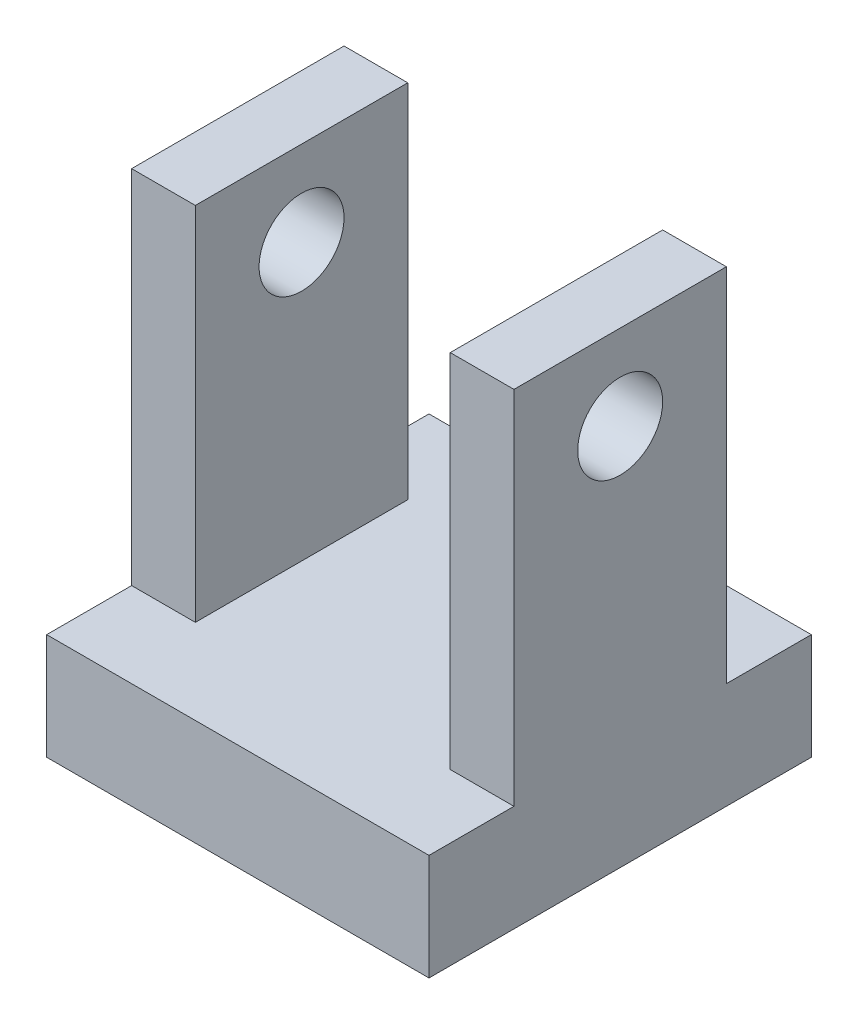
ISO-10303-21;
HEADER;
FILE_DESCRIPTION(('STEP AP214'),'2;1');
FILE_NAME('part.step','',(''),(''),'','','');
FILE_SCHEMA(('AUTOMOTIVE_DESIGN { 1 0 10303 214 1 1 1 1 }'));
ENDSEC;
DATA;
#1=APPLICATION_CONTEXT('core data for automotive mechanical design processes');
#2=APPLICATION_PROTOCOL_DEFINITION('international standard','automotive_design',2000,#1);
#3=PRODUCT_CONTEXT('',#1,'mechanical');
#4=PRODUCT('Part','Part','',(#3));
#5=PRODUCT_RELATED_PRODUCT_CATEGORY('part','',(#4));
#6=PRODUCT_DEFINITION_FORMATION('','',#4);
#7=PRODUCT_DEFINITION_CONTEXT('part definition',#1,'design');
#8=PRODUCT_DEFINITION('design','',#6,#7);
#9=PRODUCT_DEFINITION_SHAPE('','',#8);
#10=(LENGTH_UNIT() NAMED_UNIT(*) SI_UNIT(.MILLI.,.METRE.));
#11=(NAMED_UNIT(*) PLANE_ANGLE_UNIT() SI_UNIT($,.RADIAN.));
#12=(NAMED_UNIT(*) SI_UNIT($,.STERADIAN.) SOLID_ANGLE_UNIT());
#13=UNCERTAINTY_MEASURE_WITH_UNIT(LENGTH_MEASURE(1.E-05),#10,'distance_accuracy_value','');
#14=(GEOMETRIC_REPRESENTATION_CONTEXT(3) GLOBAL_UNCERTAINTY_ASSIGNED_CONTEXT((#13)) GLOBAL_UNIT_ASSIGNED_CONTEXT((#10,
#11,#12)) REPRESENTATION_CONTEXT('',''));
#15=CARTESIAN_POINT('',(0.,0.,0.));
#16=DIRECTION('',(0.,0.,1.));
#17=DIRECTION('',(1.,0.,0.));
#18=AXIS2_PLACEMENT_3D('',#15,#16,#17);
#19=CARTESIAN_POINT('',(45.,110.,-25.));
#20=DIRECTION('',(0.,0.,1.));
#21=DIRECTION('',(0.,-1.,0.));
#22=AXIS2_PLACEMENT_3D('',#19,#20,#21);
#23=PLANE('',#22);
#24=DIRECTION('',(-1.,0.,0.));
#25=VECTOR('',#24,1.);
#26=CARTESIAN_POINT('',(45.,25.,-25.));
#27=LINE('',#26,#25);
#28=CARTESIAN_POINT('',(45.,25.,-25.));
#29=VERTEX_POINT('',#28);
#30=CARTESIAN_POINT('',(30.,25.,-25.));
#31=VERTEX_POINT('',#30);
#32=EDGE_CURVE('E180',#29,#31,#27,.T.);
#33=ORIENTED_EDGE('',*,*,#32,.T.);
#34=DIRECTION('',(0.,1.,0.));
#35=VECTOR('',#34,1.);
#36=CARTESIAN_POINT('',(30.,110.,-25.));
#37=LINE('',#36,#35);
#38=CARTESIAN_POINT('',(30.,110.,-25.));
#39=VERTEX_POINT('',#38);
#40=EDGE_CURVE('E155',#31,#39,#37,.T.);
#41=ORIENTED_EDGE('',*,*,#40,.T.);
#42=DIRECTION('',(-1.,0.,0.));
#43=VECTOR('',#42,1.);
#44=CARTESIAN_POINT('',(45.,110.,-25.));
#45=LINE('',#44,#43);
#46=CARTESIAN_POINT('',(45.,110.,-25.));
#47=VERTEX_POINT('',#46);
#48=EDGE_CURVE('E177',#47,#39,#45,.T.);
#49=ORIENTED_EDGE('',*,*,#48,.F.);
#50=DIRECTION('',(0.,1.,0.));
#51=VECTOR('',#50,1.);
#52=CARTESIAN_POINT('',(45.,110.,-25.));
#53=LINE('',#52,#51);
#54=EDGE_CURVE('E126',#29,#47,#53,.T.);
#55=ORIENTED_EDGE('',*,*,#54,.F.);
#56=EDGE_LOOP('',(#33,#41,#49,#55));
#57=FACE_BOUND('',#56,.T.);
#58=ADVANCED_FACE('F39',(#57),#23,.F.);
#59=CARTESIAN_POINT('',(45.,110.,25.));
#60=DIRECTION('',(0.,-1.,0.));
#61=DIRECTION('',(0.,0.,-1.));
#62=AXIS2_PLACEMENT_3D('',#59,#60,#61);
#63=PLANE('',#62);
#64=ORIENTED_EDGE('',*,*,#48,.T.);
#65=DIRECTION('',(0.,0.,1.));
#66=VECTOR('',#65,1.);
#67=CARTESIAN_POINT('',(30.,110.,-65.));
#68=LINE('',#67,#66);
#69=CARTESIAN_POINT('',(30.,110.,25.));
#70=VERTEX_POINT('',#69);
#71=EDGE_CURVE('E137',#39,#70,#68,.T.);
#72=ORIENTED_EDGE('',*,*,#71,.T.);
#73=DIRECTION('',(-1.,0.,0.));
#74=VECTOR('',#73,1.);
#75=CARTESIAN_POINT('',(45.,110.,25.));
#76=LINE('',#75,#74);
#77=CARTESIAN_POINT('',(45.,110.,25.));
#78=VERTEX_POINT('',#77);
#79=EDGE_CURVE('E133',#78,#70,#76,.T.);
#80=ORIENTED_EDGE('',*,*,#79,.F.);
#81=DIRECTION('',(0.,0.,1.));
#82=VECTOR('',#81,1.);
#83=CARTESIAN_POINT('',(45.,110.,25.));
#84=LINE('',#83,#82);
#85=EDGE_CURVE('E119',#47,#78,#84,.T.);
#86=ORIENTED_EDGE('',*,*,#85,.F.);
#87=EDGE_LOOP('',(#64,#72,#80,#86));
#88=FACE_BOUND('',#87,.T.);
#89=ADVANCED_FACE('F134',(#88),#63,.F.);
#90=CARTESIAN_POINT('',(45.,25.,25.));
#91=DIRECTION('',(0.,0.,-1.));
#92=DIRECTION('',(-1.,0.,0.));
#93=AXIS2_PLACEMENT_3D('',#90,#91,#92);
#94=PLANE('',#93);
#95=ORIENTED_EDGE('',*,*,#79,.T.);
#96=DIRECTION('',(0.,1.,0.));
#97=VECTOR('',#96,1.);
#98=CARTESIAN_POINT('',(30.,25.,25.));
#99=LINE('',#98,#97);
#100=CARTESIAN_POINT('',(30.,25.,25.));
#101=VERTEX_POINT('',#100);
#102=EDGE_CURVE('E218',#101,#70,#99,.T.);
#103=ORIENTED_EDGE('',*,*,#102,.F.);
#104=DIRECTION('',(-1.,0.,0.));
#105=VECTOR('',#104,1.);
#106=CARTESIAN_POINT('',(45.,25.,25.));
#107=LINE('',#106,#105);
#108=CARTESIAN_POINT('',(45.,25.,25.));
#109=VERTEX_POINT('',#108);
#110=EDGE_CURVE('E145',#109,#101,#107,.T.);
#111=ORIENTED_EDGE('',*,*,#110,.F.);
#112=DIRECTION('',(0.,-1.,0.));
#113=VECTOR('',#112,1.);
#114=CARTESIAN_POINT('',(45.,25.,25.));
#115=LINE('',#114,#113);
#116=EDGE_CURVE('E123',#78,#109,#115,.T.);
#117=ORIENTED_EDGE('',*,*,#116,.F.);
#118=EDGE_LOOP('',(#95,#103,#111,#117));
#119=FACE_BOUND('',#118,.T.);
#120=ADVANCED_FACE('F143',(#119),#94,.F.);
#121=CARTESIAN_POINT('',(45.,0.,45.));
#122=DIRECTION('',(0.,0.,-1.));
#123=DIRECTION('',(-1.,0.,0.));
#124=AXIS2_PLACEMENT_3D('',#121,#122,#123);
#125=PLANE('',#124);
#126=DIRECTION('',(0.,-1.,0.));
#127=VECTOR('',#126,1.);
#128=CARTESIAN_POINT('',(-45.,0.,45.));
#129=LINE('',#128,#127);
#130=CARTESIAN_POINT('',(-45.,25.,45.));
#131=VERTEX_POINT('',#130);
#132=CARTESIAN_POINT('',(-45.,0.,45.));
#133=VERTEX_POINT('',#132);
#134=EDGE_CURVE('E151',#131,#133,#129,.T.);
#135=ORIENTED_EDGE('',*,*,#134,.T.);
#136=DIRECTION('',(-1.,0.,0.));
#137=VECTOR('',#136,1.);
#138=CARTESIAN_POINT('',(45.,0.,45.));
#139=LINE('',#138,#137);
#140=CARTESIAN_POINT('',(45.,0.,45.));
#141=VERTEX_POINT('',#140);
#142=EDGE_CURVE('E11',#141,#133,#139,.T.);
#143=ORIENTED_EDGE('',*,*,#142,.F.);
#144=DIRECTION('',(0.,-1.,0.));
#145=VECTOR('',#144,1.);
#146=CARTESIAN_POINT('',(45.,0.,45.));
#147=LINE('',#146,#145);
#148=CARTESIAN_POINT('',(45.,25.,45.));
#149=VERTEX_POINT('',#148);
#150=EDGE_CURVE('E173',#149,#141,#147,.T.);
#151=ORIENTED_EDGE('',*,*,#150,.F.);
#152=DIRECTION('',(-1.,0.,0.));
#153=VECTOR('',#152,1.);
#154=CARTESIAN_POINT('',(45.,25.,45.));
#155=LINE('',#154,#153);
#156=EDGE_CURVE('E147',#149,#131,#155,.T.);
#157=ORIENTED_EDGE('',*,*,#156,.T.);
#158=EDGE_LOOP('',(#135,#143,#151,#157));
#159=FACE_BOUND('',#158,.T.);
#160=ADVANCED_FACE('F41',(#159),#125,.F.);
#161=CARTESIAN_POINT('',(45.,0.,-45.));
#162=DIRECTION('',(0.,1.,0.));
#163=DIRECTION('',(0.,0.,1.));
#164=AXIS2_PLACEMENT_3D('',#161,#162,#163);
#165=PLANE('',#164);
#166=DIRECTION('',(0.,0.,-1.));
#167=VECTOR('',#166,1.);
#168=CARTESIAN_POINT('',(-45.,0.,-45.));
#169=LINE('',#168,#167);
#170=CARTESIAN_POINT('',(-45.,0.,-45.));
#171=VERTEX_POINT('',#170);
#172=EDGE_CURVE('E154',#133,#171,#169,.T.);
#173=ORIENTED_EDGE('',*,*,#172,.T.);
#174=DIRECTION('',(-1.,0.,0.));
#175=VECTOR('',#174,1.);
#176=CARTESIAN_POINT('',(45.,0.,-45.));
#177=LINE('',#176,#175);
#178=CARTESIAN_POINT('',(45.,0.,-45.));
#179=VERTEX_POINT('',#178);
#180=EDGE_CURVE('E48',#179,#171,#177,.T.);
#181=ORIENTED_EDGE('',*,*,#180,.F.);
#182=DIRECTION('',(0.,0.,-1.));
#183=VECTOR('',#182,1.);
#184=CARTESIAN_POINT('',(45.,0.,-45.));
#185=LINE('',#184,#183);
#186=EDGE_CURVE('E104',#141,#179,#185,.T.);
#187=ORIENTED_EDGE('',*,*,#186,.F.);
#188=ORIENTED_EDGE('',*,*,#142,.T.);
#189=EDGE_LOOP('',(#173,#181,#187,#188));
#190=FACE_BOUND('',#189,.T.);
#191=ADVANCED_FACE('F274',(#190),#165,.F.);
#192=CARTESIAN_POINT('',(45.,25.,-45.));
#193=DIRECTION('',(0.,0.,1.));
#194=DIRECTION('',(0.,-1.,0.));
#195=AXIS2_PLACEMENT_3D('',#192,#193,#194);
#196=PLANE('',#195);
#197=DIRECTION('',(0.,1.,0.));
#198=VECTOR('',#197,1.);
#199=CARTESIAN_POINT('',(-45.,25.,-45.));
#200=LINE('',#199,#198);
#201=CARTESIAN_POINT('',(-45.,25.,-45.));
#202=VERTEX_POINT('',#201);
#203=EDGE_CURVE('E157',#171,#202,#200,.T.);
#204=ORIENTED_EDGE('',*,*,#203,.T.);
#205=DIRECTION('',(-1.,0.,0.));
#206=VECTOR('',#205,1.);
#207=CARTESIAN_POINT('',(45.,25.,-45.));
#208=LINE('',#207,#206);
#209=CARTESIAN_POINT('',(45.,25.,-45.));
#210=VERTEX_POINT('',#209);
#211=EDGE_CURVE('E183',#210,#202,#208,.T.);
#212=ORIENTED_EDGE('',*,*,#211,.F.);
#213=DIRECTION('',(0.,1.,0.));
#214=VECTOR('',#213,1.);
#215=CARTESIAN_POINT('',(45.,25.,-45.));
#216=LINE('',#215,#214);
#217=EDGE_CURVE('E192',#179,#210,#216,.T.);
#218=ORIENTED_EDGE('',*,*,#217,.F.);
#219=ORIENTED_EDGE('',*,*,#180,.T.);
#220=EDGE_LOOP('',(#204,#212,#218,#219));
#221=FACE_BOUND('',#220,.T.);
#222=ADVANCED_FACE('F189',(#221),#196,.F.);
#223=CARTESIAN_POINT('',(-30.,110.,-25.));
#224=VERTEX_POINT('',#223);
#225=CARTESIAN_POINT('',(-45.,110.,-25.));
#226=VERTEX_POINT('',#225);
#227=EDGE_CURVE('E140',#224,#226,#45,.T.);
#228=ORIENTED_EDGE('',*,*,#227,.F.);
#229=DIRECTION('',(0.,-1.,0.));
#230=VECTOR('',#229,1.);
#231=CARTESIAN_POINT('',(-30.,110.,-25.));
#232=LINE('',#231,#230);
#233=CARTESIAN_POINT('',(-30.,25.,-25.));
#234=VERTEX_POINT('',#233);
#235=EDGE_CURVE('E212',#224,#234,#232,.T.);
#236=ORIENTED_EDGE('',*,*,#235,.T.);
#237=CARTESIAN_POINT('',(-45.,25.,-25.));
#238=VERTEX_POINT('',#237);
#239=EDGE_CURVE('E179',#234,#238,#27,.T.);
#240=ORIENTED_EDGE('',*,*,#239,.T.);
#241=DIRECTION('',(0.,1.,0.));
#242=VECTOR('',#241,1.);
#243=CARTESIAN_POINT('',(-45.,110.,-25.));
#244=LINE('',#243,#242);
#245=EDGE_CURVE('E163',#238,#226,#244,.T.);
#246=ORIENTED_EDGE('',*,*,#245,.T.);
#247=EDGE_LOOP('',(#228,#236,#240,#246));
#248=FACE_BOUND('',#247,.T.);
#249=ADVANCED_FACE('F258',(#248),#23,.F.);
#250=CARTESIAN_POINT('',(-30.,110.,25.));
#251=VERTEX_POINT('',#250);
#252=CARTESIAN_POINT('',(-45.,110.,25.));
#253=VERTEX_POINT('',#252);
#254=EDGE_CURVE('E141',#251,#253,#76,.T.);
#255=ORIENTED_EDGE('',*,*,#254,.F.);
#256=DIRECTION('',(0.,0.,1.));
#257=VECTOR('',#256,1.);
#258=CARTESIAN_POINT('',(-30.,110.,-65.));
#259=LINE('',#258,#257);
#260=EDGE_CURVE('E215',#224,#251,#259,.T.);
#261=ORIENTED_EDGE('',*,*,#260,.F.);
#262=ORIENTED_EDGE('',*,*,#227,.T.);
#263=DIRECTION('',(0.,0.,1.));
#264=VECTOR('',#263,1.);
#265=CARTESIAN_POINT('',(-45.,110.,25.));
#266=LINE('',#265,#264);
#267=EDGE_CURVE('E166',#226,#253,#266,.T.);
#268=ORIENTED_EDGE('',*,*,#267,.T.);
#269=EDGE_LOOP('',(#255,#261,#262,#268));
#270=FACE_BOUND('',#269,.T.);
#271=ADVANCED_FACE('F264',(#270),#63,.F.);
#272=CARTESIAN_POINT('',(-30.,25.,25.));
#273=VERTEX_POINT('',#272);
#274=CARTESIAN_POINT('',(-45.,25.,25.));
#275=VERTEX_POINT('',#274);
#276=EDGE_CURVE('E175',#273,#275,#107,.T.);
#277=ORIENTED_EDGE('',*,*,#276,.F.);
#278=DIRECTION('',(0.,-1.,0.));
#279=VECTOR('',#278,1.);
#280=CARTESIAN_POINT('',(-30.,110.,25.));
#281=LINE('',#280,#279);
#282=EDGE_CURVE('E55',#251,#273,#281,.T.);
#283=ORIENTED_EDGE('',*,*,#282,.F.);
#284=ORIENTED_EDGE('',*,*,#254,.T.);
#285=DIRECTION('',(0.,-1.,0.));
#286=VECTOR('',#285,1.);
#287=CARTESIAN_POINT('',(-45.,25.,25.));
#288=LINE('',#287,#286);
#289=EDGE_CURVE('E169',#253,#275,#288,.T.);
#290=ORIENTED_EDGE('',*,*,#289,.T.);
#291=EDGE_LOOP('',(#277,#283,#284,#290));
#292=FACE_BOUND('',#291,.T.);
#293=ADVANCED_FACE('F272',(#292),#94,.F.);
#294=CARTESIAN_POINT('',(45.,25.,45.));
#295=DIRECTION('',(0.,-1.,0.));
#296=DIRECTION('',(0.,0.,-1.));
#297=AXIS2_PLACEMENT_3D('',#294,#295,#296);
#298=PLANE('',#297);
#299=DIRECTION('',(0.,0.,1.));
#300=VECTOR('',#299,1.);
#301=CARTESIAN_POINT('',(-45.,25.,45.));
#302=LINE('',#301,#300);
#303=EDGE_CURVE('E96',#275,#131,#302,.T.);
#304=ORIENTED_EDGE('',*,*,#303,.T.);
#305=ORIENTED_EDGE('',*,*,#156,.F.);
#306=DIRECTION('',(0.,0.,1.));
#307=VECTOR('',#306,1.);
#308=CARTESIAN_POINT('',(45.,25.,45.));
#309=LINE('',#308,#307);
#310=EDGE_CURVE('E64',#109,#149,#309,.T.);
#311=ORIENTED_EDGE('',*,*,#310,.F.);
#312=ORIENTED_EDGE('',*,*,#110,.T.);
#313=DIRECTION('',(0.,0.,1.));
#314=VECTOR('',#313,1.);
#315=CARTESIAN_POINT('',(30.,25.,-65.));
#316=LINE('',#315,#314);
#317=EDGE_CURVE('E220',#31,#101,#316,.T.);
#318=ORIENTED_EDGE('',*,*,#317,.F.);
#319=ORIENTED_EDGE('',*,*,#32,.F.);
#320=DIRECTION('',(0.,0.,1.));
#321=VECTOR('',#320,1.);
#322=CARTESIAN_POINT('',(45.,25.,-25.));
#323=LINE('',#322,#321);
#324=EDGE_CURVE('E203',#210,#29,#323,.T.);
#325=ORIENTED_EDGE('',*,*,#324,.F.);
#326=ORIENTED_EDGE('',*,*,#211,.T.);
#327=DIRECTION('',(0.,0.,1.));
#328=VECTOR('',#327,1.);
#329=CARTESIAN_POINT('',(-45.,25.,-25.));
#330=LINE('',#329,#328);
#331=EDGE_CURVE('E160',#202,#238,#330,.T.);
#332=ORIENTED_EDGE('',*,*,#331,.T.);
#333=ORIENTED_EDGE('',*,*,#239,.F.);
#334=DIRECTION('',(0.,0.,1.));
#335=VECTOR('',#334,1.);
#336=CARTESIAN_POINT('',(-30.,25.,-65.));
#337=LINE('',#336,#335);
#338=EDGE_CURVE('E217',#234,#273,#337,.T.);
#339=ORIENTED_EDGE('',*,*,#338,.T.);
#340=ORIENTED_EDGE('',*,*,#276,.T.);
#341=EDGE_LOOP('',(#304,#305,#311,#312,#318,#319,#325,#326,#332,#333,#339,#340));
#342=FACE_BOUND('',#341,.T.);
#343=ADVANCED_FACE('F199',(#342),#298,.F.);
#344=CARTESIAN_POINT('',(45.,0.,0.));
#345=DIRECTION('',(-1.,0.,0.));
#346=DIRECTION('',(0.,0.,1.));
#347=AXIS2_PLACEMENT_3D('',#344,#345,#346);
#348=PLANE('',#347);
#349=CARTESIAN_POINT('',(45.,90.,0.));
#350=DIRECTION('',(1.,0.,0.));
#351=DIRECTION('',(0.,0.,-1.));
#352=AXIS2_PLACEMENT_3D('',#349,#350,#351);
#353=CIRCLE('',#352,10.);
#354=CARTESIAN_POINT('',(45.,90.,-10.));
#355=VERTEX_POINT('',#354);
#356=EDGE_CURVE('E230',#355,#355,#353,.T.);
#357=ORIENTED_EDGE('',*,*,#356,.F.);
#358=EDGE_LOOP('',(#357));
#359=FACE_BOUND('',#358,.T.);
#360=ORIENTED_EDGE('',*,*,#150,.T.);
#361=ORIENTED_EDGE('',*,*,#186,.T.);
#362=ORIENTED_EDGE('',*,*,#217,.T.);
#363=ORIENTED_EDGE('',*,*,#324,.T.);
#364=ORIENTED_EDGE('',*,*,#54,.T.);
#365=ORIENTED_EDGE('',*,*,#85,.T.);
#366=ORIENTED_EDGE('',*,*,#116,.T.);
#367=ORIENTED_EDGE('',*,*,#310,.T.);
#368=EDGE_LOOP('',(#360,#361,#362,#363,#364,#365,#366,#367));
#369=FACE_BOUND('',#368,.T.);
#370=ADVANCED_FACE('F121',(#359,#369),#348,.F.);
#371=CARTESIAN_POINT('',(-45.,0.,0.));
#372=DIRECTION('',(-1.,0.,0.));
#373=DIRECTION('',(0.,0.,1.));
#374=AXIS2_PLACEMENT_3D('',#371,#372,#373);
#375=PLANE('',#374);
#376=CARTESIAN_POINT('',(-45.,90.,0.));
#377=DIRECTION('',(1.,0.,0.));
#378=DIRECTION('',(0.,0.,-1.));
#379=AXIS2_PLACEMENT_3D('',#376,#377,#378);
#380=CIRCLE('',#379,10.);
#381=CARTESIAN_POINT('',(-45.,90.,-10.));
#382=VERTEX_POINT('',#381);
#383=EDGE_CURVE('E233',#382,#382,#380,.T.);
#384=ORIENTED_EDGE('',*,*,#383,.T.);
#385=EDGE_LOOP('',(#384));
#386=FACE_BOUND('',#385,.T.);
#387=ORIENTED_EDGE('',*,*,#134,.F.);
#388=ORIENTED_EDGE('',*,*,#303,.F.);
#389=ORIENTED_EDGE('',*,*,#289,.F.);
#390=ORIENTED_EDGE('',*,*,#267,.F.);
#391=ORIENTED_EDGE('',*,*,#245,.F.);
#392=ORIENTED_EDGE('',*,*,#331,.F.);
#393=ORIENTED_EDGE('',*,*,#203,.F.);
#394=ORIENTED_EDGE('',*,*,#172,.F.);
#395=EDGE_LOOP('',(#387,#388,#389,#390,#391,#392,#393,#394));
#396=FACE_BOUND('',#395,.T.);
#397=ADVANCED_FACE('F195',(#386,#396),#375,.T.);
#398=CARTESIAN_POINT('',(30.,25.,-65.));
#399=DIRECTION('',(1.,0.,0.));
#400=DIRECTION('',(0.,1.,0.));
#401=AXIS2_PLACEMENT_3D('',#398,#399,#400);
#402=PLANE('',#401);
#403=CARTESIAN_POINT('',(30.,90.,0.));
#404=DIRECTION('',(1.,0.,0.));
#405=DIRECTION('',(0.,1.,0.));
#406=AXIS2_PLACEMENT_3D('',#403,#404,#405);
#407=CIRCLE('',#406,10.);
#408=CARTESIAN_POINT('',(30.,90.,-10.));
#409=VERTEX_POINT('',#408);
#410=EDGE_CURVE('E227',#409,#409,#407,.T.);
#411=ORIENTED_EDGE('',*,*,#410,.T.);
#412=EDGE_LOOP('',(#411));
#413=FACE_BOUND('',#412,.T.);
#414=ORIENTED_EDGE('',*,*,#317,.T.);
#415=ORIENTED_EDGE('',*,*,#102,.T.);
#416=ORIENTED_EDGE('',*,*,#71,.F.);
#417=ORIENTED_EDGE('',*,*,#40,.F.);
#418=EDGE_LOOP('',(#414,#415,#416,#417));
#419=FACE_BOUND('',#418,.T.);
#420=ADVANCED_FACE('F252',(#413,#419),#402,.F.);
#421=CARTESIAN_POINT('',(-30.,110.,-65.));
#422=DIRECTION('',(-1.,0.,0.));
#423=DIRECTION('',(0.,-1.,0.));
#424=AXIS2_PLACEMENT_3D('',#421,#422,#423);
#425=PLANE('',#424);
#426=CARTESIAN_POINT('',(-30.,90.,0.));
#427=DIRECTION('',(-1.,0.,0.));
#428=DIRECTION('',(0.,-1.,0.));
#429=AXIS2_PLACEMENT_3D('',#426,#427,#428);
#430=CIRCLE('',#429,10.);
#431=CARTESIAN_POINT('',(-30.,90.,-10.));
#432=VERTEX_POINT('',#431);
#433=EDGE_CURVE('E43',#432,#432,#430,.T.);
#434=ORIENTED_EDGE('',*,*,#433,.T.);
#435=EDGE_LOOP('',(#434));
#436=FACE_BOUND('',#435,.T.);
#437=ORIENTED_EDGE('',*,*,#260,.T.);
#438=ORIENTED_EDGE('',*,*,#282,.T.);
#439=ORIENTED_EDGE('',*,*,#338,.F.);
#440=ORIENTED_EDGE('',*,*,#235,.F.);
#441=EDGE_LOOP('',(#437,#438,#439,#440));
#442=FACE_BOUND('',#441,.T.);
#443=ADVANCED_FACE('F240',(#436,#442),#425,.F.);
#444=CARTESIAN_POINT('',(-45.,90.,0.));
#445=DIRECTION('',(1.,0.,0.));
#446=DIRECTION('',(0.,0.,-1.));
#447=AXIS2_PLACEMENT_3D('',#444,#445,#446);
#448=CYLINDRICAL_SURFACE('',#447,10.);
#449=CARTESIAN_POINT('',(-45.,90.,-10.));
#450=CARTESIAN_POINT('',(-44.84375,90.,-10.));
#451=CARTESIAN_POINT('',(-44.6875,90.,-10.));
#452=CARTESIAN_POINT('',(-44.375,90.,-10.));
#453=CARTESIAN_POINT('',(-44.21875,90.,-10.));
#454=CARTESIAN_POINT('',(-43.90625,90.,-10.));
#455=CARTESIAN_POINT('',(-43.75,90.,-10.));
#456=CARTESIAN_POINT('',(-43.4375,90.,-10.));
#457=CARTESIAN_POINT('',(-43.28125,90.,-10.));
#458=CARTESIAN_POINT('',(-42.96875,90.,-10.));
#459=CARTESIAN_POINT('',(-42.8125,90.,-10.));
#460=CARTESIAN_POINT('',(-42.5,90.,-10.));
#461=CARTESIAN_POINT('',(-42.34375,90.,-10.));
#462=CARTESIAN_POINT('',(-42.03125,90.,-10.));
#463=CARTESIAN_POINT('',(-41.875,90.,-10.));
#464=CARTESIAN_POINT('',(-41.5625,90.,-10.));
#465=CARTESIAN_POINT('',(-41.40625,90.,-10.));
#466=CARTESIAN_POINT('',(-41.09375,90.,-10.));
#467=CARTESIAN_POINT('',(-40.9375,90.,-10.));
#468=CARTESIAN_POINT('',(-40.625,90.,-10.));
#469=CARTESIAN_POINT('',(-40.46875,90.,-10.));
#470=CARTESIAN_POINT('',(-40.15625,90.,-10.));
#471=CARTESIAN_POINT('',(-40.,90.,-10.));
#472=CARTESIAN_POINT('',(-39.6875,90.,-10.));
#473=CARTESIAN_POINT('',(-39.53125,90.,-10.));
#474=CARTESIAN_POINT('',(-39.21875,90.,-10.));
#475=CARTESIAN_POINT('',(-39.0625,90.,-10.));
#476=CARTESIAN_POINT('',(-38.75,90.,-10.));
#477=CARTESIAN_POINT('',(-38.59375,90.,-10.));
#478=CARTESIAN_POINT('',(-38.28125,90.,-10.));
#479=CARTESIAN_POINT('',(-38.125,90.,-10.));
#480=CARTESIAN_POINT('',(-37.8125,90.,-10.));
#481=CARTESIAN_POINT('',(-37.65625,90.,-10.));
#482=CARTESIAN_POINT('',(-37.34375,90.,-10.));
#483=CARTESIAN_POINT('',(-37.1875,90.,-10.));
#484=CARTESIAN_POINT('',(-36.875,90.,-10.));
#485=CARTESIAN_POINT('',(-36.71875,90.,-10.));
#486=CARTESIAN_POINT('',(-36.40625,90.,-10.));
#487=CARTESIAN_POINT('',(-36.25,90.,-10.));
#488=CARTESIAN_POINT('',(-35.9375,90.,-10.));
#489=CARTESIAN_POINT('',(-35.78125,90.,-10.));
#490=CARTESIAN_POINT('',(-35.46875,90.,-10.));
#491=CARTESIAN_POINT('',(-35.3125,90.,-10.));
#492=CARTESIAN_POINT('',(-35.,90.,-10.));
#493=CARTESIAN_POINT('',(-34.84375,90.,-10.));
#494=CARTESIAN_POINT('',(-34.53125,90.,-10.));
#495=CARTESIAN_POINT('',(-34.375,90.,-10.));
#496=CARTESIAN_POINT('',(-34.0625,90.,-10.));
#497=CARTESIAN_POINT('',(-33.90625,90.,-10.));
#498=CARTESIAN_POINT('',(-33.59375,90.,-10.));
#499=CARTESIAN_POINT('',(-33.4375,90.,-10.));
#500=CARTESIAN_POINT('',(-33.125,90.,-10.));
#501=CARTESIAN_POINT('',(-32.96875,90.,-10.));
#502=CARTESIAN_POINT('',(-32.65625,90.,-10.));
#503=CARTESIAN_POINT('',(-32.5,90.,-10.));
#504=CARTESIAN_POINT('',(-32.1875,90.,-10.));
#505=CARTESIAN_POINT('',(-32.03125,90.,-10.));
#506=CARTESIAN_POINT('',(-31.71875,90.,-10.));
#507=CARTESIAN_POINT('',(-31.5625,90.,-10.));
#508=CARTESIAN_POINT('',(-31.25,90.,-10.));
#509=CARTESIAN_POINT('',(-31.09375,90.,-10.));
#510=CARTESIAN_POINT('',(-30.78125,90.,-10.));
#511=CARTESIAN_POINT('',(-30.625,90.,-10.));
#512=CARTESIAN_POINT('',(-30.3125,90.,-10.));
#513=CARTESIAN_POINT('',(-30.15625,90.,-10.));
#514=CARTESIAN_POINT('',(-30.,90.,-10.));
#515=B_SPLINE_CURVE_WITH_KNOTS('',3,(#449,#450,#451,#452,#453,#454,#455,#456,#457,#458,#459,
#460,#461,#462,#463,#464,#465,#466,#467,#468,#469,#470,#471,#472,#473,#474,#475,#476,#477,#478,
#479,#480,#481,#482,#483,#484,#485,#486,#487,#488,#489,#490,#491,#492,#493,#494,#495,#496,#497,
#498,#499,#500,#501,#502,#503,#504,#505,#506,#507,#508,#509,#510,#511,#512,#513,#514),
.UNSPECIFIED.,.F.,.F.,(4,2,2,2,2,2,2,2,2,2,2,2,2,2,2,2,2,2,2,2,2,2,2,2,2,2,2,2,2,2,2,2,4),(0.,
0.468749999999997,0.937499999999994,1.40625,1.87499999999999,2.34375,2.8125,3.28125,3.75,
4.21875,4.6875,5.15625,5.625,6.09374999999999,6.5625,7.03125,7.5,7.96875,8.4375,8.90625,9.375,
9.84375,10.3125,10.78125,11.25,11.71875,12.1875,12.65625,13.125,13.59375,14.0625,14.53125,15.),.UNSPECIFIED.);
#516=EDGE_CURVE('BSEAM242',#382,#432,#515,.T.);
#517=ORIENTED_EDGE('',*,*,#383,.F.);
#518=ORIENTED_EDGE('',*,*,#433,.F.);
#519=ORIENTED_EDGE('',*,*,#516,.T.);
#520=ORIENTED_EDGE('',*,*,#516,.F.);
#521=EDGE_LOOP('',(#517,#519,#518,#520));
#522=FACE_BOUND('',#521,.T.);
#523=ADVANCED_FACE('F242',(#522),#448,.F.);
#524=CARTESIAN_POINT('',(45.,90.,-10.));
#525=CARTESIAN_POINT('',(44.84375,90.,-10.));
#526=CARTESIAN_POINT('',(44.6875,90.,-10.));
#527=CARTESIAN_POINT('',(44.375,90.,-10.));
#528=CARTESIAN_POINT('',(44.21875,90.,-10.));
#529=CARTESIAN_POINT('',(43.90625,90.,-10.));
#530=CARTESIAN_POINT('',(43.75,90.,-10.));
#531=CARTESIAN_POINT('',(43.4375,90.,-10.));
#532=CARTESIAN_POINT('',(43.28125,90.,-10.));
#533=CARTESIAN_POINT('',(42.96875,90.,-10.));
#534=CARTESIAN_POINT('',(42.8125,90.,-10.));
#535=CARTESIAN_POINT('',(42.5,90.,-10.));
#536=CARTESIAN_POINT('',(42.34375,90.,-10.));
#537=CARTESIAN_POINT('',(42.03125,90.,-10.));
#538=CARTESIAN_POINT('',(41.875,90.,-10.));
#539=CARTESIAN_POINT('',(41.5625,90.,-10.));
#540=CARTESIAN_POINT('',(41.40625,90.,-10.));
#541=CARTESIAN_POINT('',(41.09375,90.,-10.));
#542=CARTESIAN_POINT('',(40.9375,90.,-10.));
#543=CARTESIAN_POINT('',(40.625,90.,-10.));
#544=CARTESIAN_POINT('',(40.46875,90.,-10.));
#545=CARTESIAN_POINT('',(40.15625,90.,-10.));
#546=CARTESIAN_POINT('',(40.,90.,-10.));
#547=CARTESIAN_POINT('',(39.6875,90.,-10.));
#548=CARTESIAN_POINT('',(39.53125,90.,-10.));
#549=CARTESIAN_POINT('',(39.21875,90.,-10.));
#550=CARTESIAN_POINT('',(39.0625,90.,-10.));
#551=CARTESIAN_POINT('',(38.75,90.,-10.));
#552=CARTESIAN_POINT('',(38.59375,90.,-10.));
#553=CARTESIAN_POINT('',(38.28125,90.,-10.));
#554=CARTESIAN_POINT('',(38.125,90.,-10.));
#555=CARTESIAN_POINT('',(37.8125,90.,-10.));
#556=CARTESIAN_POINT('',(37.65625,90.,-10.));
#557=CARTESIAN_POINT('',(37.34375,90.,-10.));
#558=CARTESIAN_POINT('',(37.1875,90.,-10.));
#559=CARTESIAN_POINT('',(36.875,90.,-10.));
#560=CARTESIAN_POINT('',(36.71875,90.,-10.));
#561=CARTESIAN_POINT('',(36.40625,90.,-10.));
#562=CARTESIAN_POINT('',(36.25,90.,-10.));
#563=CARTESIAN_POINT('',(35.9375,90.,-10.));
#564=CARTESIAN_POINT('',(35.78125,90.,-10.));
#565=CARTESIAN_POINT('',(35.46875,90.,-10.));
#566=CARTESIAN_POINT('',(35.3125,90.,-10.));
#567=CARTESIAN_POINT('',(35.,90.,-10.));
#568=CARTESIAN_POINT('',(34.84375,90.,-10.));
#569=CARTESIAN_POINT('',(34.53125,90.,-10.));
#570=CARTESIAN_POINT('',(34.375,90.,-10.));
#571=CARTESIAN_POINT('',(34.0625,90.,-10.));
#572=CARTESIAN_POINT('',(33.90625,90.,-10.));
#573=CARTESIAN_POINT('',(33.59375,90.,-10.));
#574=CARTESIAN_POINT('',(33.4375,90.,-10.));
#575=CARTESIAN_POINT('',(33.125,90.,-10.));
#576=CARTESIAN_POINT('',(32.96875,90.,-10.));
#577=CARTESIAN_POINT('',(32.65625,90.,-10.));
#578=CARTESIAN_POINT('',(32.5,90.,-10.));
#579=CARTESIAN_POINT('',(32.1875,90.,-10.));
#580=CARTESIAN_POINT('',(32.03125,90.,-10.));
#581=CARTESIAN_POINT('',(31.71875,90.,-10.));
#582=CARTESIAN_POINT('',(31.5625,90.,-10.));
#583=CARTESIAN_POINT('',(31.25,90.,-10.));
#584=CARTESIAN_POINT('',(31.09375,90.,-10.));
#585=CARTESIAN_POINT('',(30.78125,90.,-10.));
#586=CARTESIAN_POINT('',(30.625,90.,-10.));
#587=CARTESIAN_POINT('',(30.3125,90.,-10.));
#588=CARTESIAN_POINT('',(30.15625,90.,-10.));
#589=CARTESIAN_POINT('',(30.,90.,-10.));
#590=B_SPLINE_CURVE_WITH_KNOTS('',3,(#524,#525,#526,#527,#528,#529,#530,#531,#532,#533,#534,
#535,#536,#537,#538,#539,#540,#541,#542,#543,#544,#545,#546,#547,#548,#549,#550,#551,#552,#553,
#554,#555,#556,#557,#558,#559,#560,#561,#562,#563,#564,#565,#566,#567,#568,#569,#570,#571,#572,
#573,#574,#575,#576,#577,#578,#579,#580,#581,#582,#583,#584,#585,#586,#587,#588,#589),
.UNSPECIFIED.,.F.,.F.,(4,2,2,2,2,2,2,2,2,2,2,2,2,2,2,2,2,2,2,2,2,2,2,2,2,2,2,2,2,2,2,2,4),(0.,
0.468750000000004,0.937499999999994,1.40625,1.875,2.34374999999999,2.8125,3.28125,3.75,
4.21874999999999,4.6875,5.15625,5.62499999999999,6.09374999999999,6.5625,7.03124999999999,
7.49999999999999,7.96875,8.43749999999999,8.90624999999999,9.37499999999999,9.84374999999998,
10.3125,10.78125,11.25,11.71875,12.1875,12.65625,13.125,13.59375,14.0625,14.53125,15.),.UNSPECIFIED.);
#591=EDGE_CURVE('BSEAM244',#355,#409,#590,.T.);
#592=ORIENTED_EDGE('',*,*,#356,.T.);
#593=ORIENTED_EDGE('',*,*,#410,.F.);
#594=ORIENTED_EDGE('',*,*,#591,.T.);
#595=ORIENTED_EDGE('',*,*,#591,.F.);
#596=EDGE_LOOP('',(#592,#594,#593,#595));
#597=FACE_BOUND('',#596,.T.);
#598=ADVANCED_FACE('F244',(#597),#448,.F.);
#599=CLOSED_SHELL('',(#58,#89,#120,#160,#191,#222,#249,#271,#293,#343,#370,#397,#420,#443,#523,#598));
#600=MANIFOLD_SOLID_BREP('B2',#599);
#601=ADVANCED_BREP_SHAPE_REPRESENTATION('',(#18,#600),#14);
#602=SHAPE_DEFINITION_REPRESENTATION(#9,#601);
ENDSEC;
END-ISO-10303-21;
